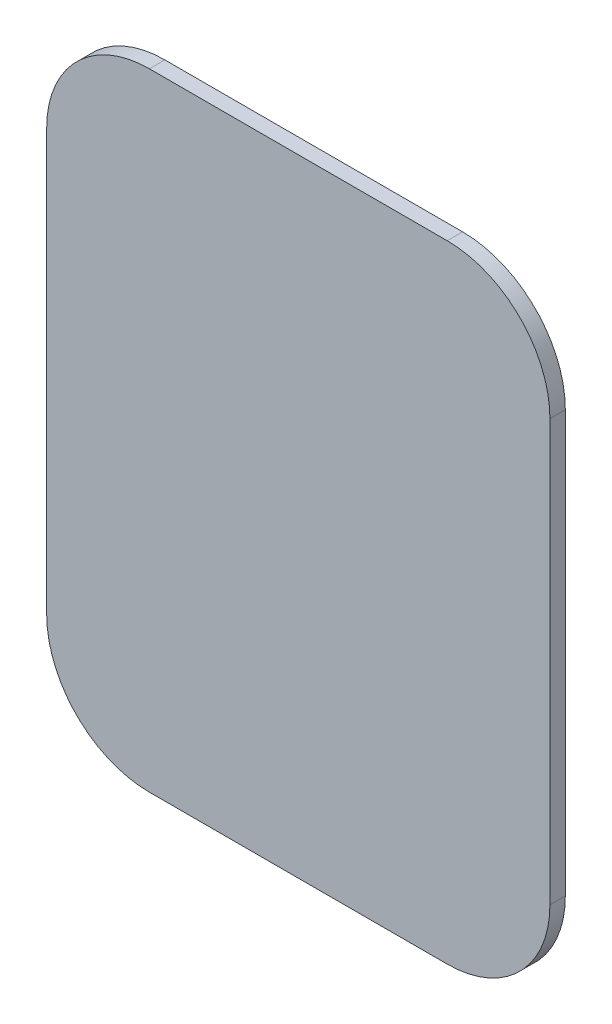
ISO-10303-21;
HEADER;
FILE_DESCRIPTION(('STEP AP214'),'2;1');
FILE_NAME('part.step','',(''),(''),'','','');
FILE_SCHEMA(('AUTOMOTIVE_DESIGN { 1 0 10303 214 1 1 1 1 }'));
ENDSEC;
DATA;
#1=APPLICATION_CONTEXT('core data for automotive mechanical design processes');
#2=APPLICATION_PROTOCOL_DEFINITION('international standard','automotive_design',2000,#1);
#3=PRODUCT_CONTEXT('',#1,'mechanical');
#4=PRODUCT('Part','Part','',(#3));
#5=PRODUCT_RELATED_PRODUCT_CATEGORY('part','',(#4));
#6=PRODUCT_DEFINITION_FORMATION('','',#4);
#7=PRODUCT_DEFINITION_CONTEXT('part definition',#1,'design');
#8=PRODUCT_DEFINITION('design','',#6,#7);
#9=PRODUCT_DEFINITION_SHAPE('','',#8);
#10=(LENGTH_UNIT() NAMED_UNIT(*) SI_UNIT(.MILLI.,.METRE.));
#11=(NAMED_UNIT(*) PLANE_ANGLE_UNIT() SI_UNIT($,.RADIAN.));
#12=(NAMED_UNIT(*) SI_UNIT($,.STERADIAN.) SOLID_ANGLE_UNIT());
#13=UNCERTAINTY_MEASURE_WITH_UNIT(LENGTH_MEASURE(1.E-05),#10,'distance_accuracy_value','');
#14=(GEOMETRIC_REPRESENTATION_CONTEXT(3) GLOBAL_UNCERTAINTY_ASSIGNED_CONTEXT((#13)) GLOBAL_UNIT_ASSIGNED_CONTEXT((#10,
#11,#12)) REPRESENTATION_CONTEXT('',''));
#15=CARTESIAN_POINT('',(0.,0.,0.));
#16=DIRECTION('',(0.,0.,1.));
#17=DIRECTION('',(1.,0.,0.));
#18=AXIS2_PLACEMENT_3D('',#15,#16,#17);
#19=CARTESIAN_POINT('',(49.,61.,3.));
#20=DIRECTION('',(-1.,0.,0.));
#21=DIRECTION('',(0.,-1.,0.));
#22=AXIS2_PLACEMENT_3D('',#19,#20,#21);
#23=PLANE('',#22);
#24=DIRECTION('',(0.,1.,0.));
#25=VECTOR('',#24,1.);
#26=CARTESIAN_POINT('',(49.,61.,3.));
#27=LINE('',#26,#25);
#28=CARTESIAN_POINT('',(49.,-41.,3.));
#29=VERTEX_POINT('',#28);
#30=CARTESIAN_POINT('',(49.,41.,3.));
#31=VERTEX_POINT('',#30);
#32=EDGE_CURVE('E140',#29,#31,#27,.T.);
#33=ORIENTED_EDGE('',*,*,#32,.F.);
#34=DIRECTION('',(0.,0.,-1.));
#35=VECTOR('',#34,1.);
#36=CARTESIAN_POINT('',(49.,-41.,3.));
#37=LINE('',#36,#35);
#38=CARTESIAN_POINT('',(49.,-41.,0.));
#39=VERTEX_POINT('',#38);
#40=EDGE_CURVE('E11',#29,#39,#37,.T.);
#41=ORIENTED_EDGE('',*,*,#40,.T.);
#42=DIRECTION('',(0.,1.,0.));
#43=VECTOR('',#42,1.);
#44=CARTESIAN_POINT('',(49.,61.,0.));
#45=LINE('',#44,#43);
#46=CARTESIAN_POINT('',(49.,41.,0.));
#47=VERTEX_POINT('',#46);
#48=EDGE_CURVE('E142',#39,#47,#45,.T.);
#49=ORIENTED_EDGE('',*,*,#48,.T.);
#50=DIRECTION('',(0.,0.,-1.));
#51=VECTOR('',#50,1.);
#52=CARTESIAN_POINT('',(49.,41.,3.));
#53=LINE('',#52,#51);
#54=EDGE_CURVE('E48',#47,#31,#53,.F.);
#55=ORIENTED_EDGE('',*,*,#54,.T.);
#56=EDGE_LOOP('',(#33,#41,#49,#55));
#57=FACE_BOUND('',#56,.T.);
#58=ADVANCED_FACE('F39',(#57),#23,.F.);
#59=CARTESIAN_POINT('',(-49.,61.,3.));
#60=DIRECTION('',(0.,-1.,0.));
#61=DIRECTION('',(0.,0.,-1.));
#62=AXIS2_PLACEMENT_3D('',#59,#60,#61);
#63=PLANE('',#62);
#64=DIRECTION('',(-1.,0.,0.));
#65=VECTOR('',#64,1.);
#66=CARTESIAN_POINT('',(-49.,61.,0.));
#67=LINE('',#66,#65);
#68=CARTESIAN_POINT('',(29.,61.,0.));
#69=VERTEX_POINT('',#68);
#70=CARTESIAN_POINT('',(-29.,61.,0.));
#71=VERTEX_POINT('',#70);
#72=EDGE_CURVE('E136',#69,#71,#67,.T.);
#73=ORIENTED_EDGE('',*,*,#72,.T.);
#74=DIRECTION('',(0.,0.,-1.));
#75=VECTOR('',#74,1.);
#76=CARTESIAN_POINT('',(-29.,61.,3.));
#77=LINE('',#76,#75);
#78=CARTESIAN_POINT('',(-29.,61.,3.));
#79=VERTEX_POINT('',#78);
#80=EDGE_CURVE('E112',#71,#79,#77,.F.);
#81=ORIENTED_EDGE('',*,*,#80,.T.);
#82=DIRECTION('',(-1.,0.,0.));
#83=VECTOR('',#82,1.);
#84=CARTESIAN_POINT('',(-49.,61.,3.));
#85=LINE('',#84,#83);
#86=CARTESIAN_POINT('',(29.,61.,3.));
#87=VERTEX_POINT('',#86);
#88=EDGE_CURVE('E192',#87,#79,#85,.T.);
#89=ORIENTED_EDGE('',*,*,#88,.F.);
#90=DIRECTION('',(0.,0.,-1.));
#91=VECTOR('',#90,1.);
#92=CARTESIAN_POINT('',(29.,61.,3.));
#93=LINE('',#92,#91);
#94=EDGE_CURVE('E118',#87,#69,#93,.T.);
#95=ORIENTED_EDGE('',*,*,#94,.T.);
#96=EDGE_LOOP('',(#73,#81,#89,#95));
#97=FACE_BOUND('',#96,.T.);
#98=ADVANCED_FACE('F196',(#97),#63,.F.);
#99=CARTESIAN_POINT('',(-49.,61.,3.));
#100=DIRECTION('',(1.,0.,0.));
#101=DIRECTION('',(0.,1.,0.));
#102=AXIS2_PLACEMENT_3D('',#99,#100,#101);
#103=PLANE('',#102);
#104=DIRECTION('',(0.,-1.,0.));
#105=VECTOR('',#104,1.);
#106=CARTESIAN_POINT('',(-49.,61.,3.));
#107=LINE('',#106,#105);
#108=CARTESIAN_POINT('',(-49.,41.,3.));
#109=VERTEX_POINT('',#108);
#110=CARTESIAN_POINT('',(-49.,-41.,3.));
#111=VERTEX_POINT('',#110);
#112=EDGE_CURVE('E127',#109,#111,#107,.T.);
#113=ORIENTED_EDGE('',*,*,#112,.F.);
#114=DIRECTION('',(0.,0.,-1.));
#115=VECTOR('',#114,1.);
#116=CARTESIAN_POINT('',(-49.,41.,3.));
#117=LINE('',#116,#115);
#118=CARTESIAN_POINT('',(-49.,41.,0.));
#119=VERTEX_POINT('',#118);
#120=EDGE_CURVE('E111',#109,#119,#117,.T.);
#121=ORIENTED_EDGE('',*,*,#120,.T.);
#122=DIRECTION('',(0.,-1.,0.));
#123=VECTOR('',#122,1.);
#124=CARTESIAN_POINT('',(-49.,61.,0.));
#125=LINE('',#124,#123);
#126=CARTESIAN_POINT('',(-49.,-41.,0.));
#127=VERTEX_POINT('',#126);
#128=EDGE_CURVE('E125',#119,#127,#125,.T.);
#129=ORIENTED_EDGE('',*,*,#128,.T.);
#130=DIRECTION('',(0.,0.,-1.));
#131=VECTOR('',#130,1.);
#132=CARTESIAN_POINT('',(-49.,-41.,3.));
#133=LINE('',#132,#131);
#134=EDGE_CURVE('E130',#127,#111,#133,.F.);
#135=ORIENTED_EDGE('',*,*,#134,.T.);
#136=EDGE_LOOP('',(#113,#121,#129,#135));
#137=FACE_BOUND('',#136,.T.);
#138=ADVANCED_FACE('F124',(#137),#103,.F.);
#139=CARTESIAN_POINT('',(-49.,-61.,3.));
#140=DIRECTION('',(0.,1.,0.));
#141=DIRECTION('',(0.,0.,1.));
#142=AXIS2_PLACEMENT_3D('',#139,#140,#141);
#143=PLANE('',#142);
#144=DIRECTION('',(1.,0.,0.));
#145=VECTOR('',#144,1.);
#146=CARTESIAN_POINT('',(-49.,-61.,3.));
#147=LINE('',#146,#145);
#148=CARTESIAN_POINT('',(-29.,-61.,3.));
#149=VERTEX_POINT('',#148);
#150=CARTESIAN_POINT('',(29.,-61.,3.));
#151=VERTEX_POINT('',#150);
#152=EDGE_CURVE('E147',#149,#151,#147,.T.);
#153=ORIENTED_EDGE('',*,*,#152,.F.);
#154=DIRECTION('',(0.,0.,-1.));
#155=VECTOR('',#154,1.);
#156=CARTESIAN_POINT('',(-29.,-61.,3.));
#157=LINE('',#156,#155);
#158=CARTESIAN_POINT('',(-29.,-61.,0.));
#159=VERTEX_POINT('',#158);
#160=EDGE_CURVE('E174',#149,#159,#157,.T.);
#161=ORIENTED_EDGE('',*,*,#160,.T.);
#162=DIRECTION('',(1.,0.,0.));
#163=VECTOR('',#162,1.);
#164=CARTESIAN_POINT('',(-49.,-61.,0.));
#165=LINE('',#164,#163);
#166=CARTESIAN_POINT('',(29.,-61.,0.));
#167=VERTEX_POINT('',#166);
#168=EDGE_CURVE('E135',#159,#167,#165,.T.);
#169=ORIENTED_EDGE('',*,*,#168,.T.);
#170=DIRECTION('',(0.,0.,-1.));
#171=VECTOR('',#170,1.);
#172=CARTESIAN_POINT('',(29.,-61.,3.));
#173=LINE('',#172,#171);
#174=EDGE_CURVE('E55',#167,#151,#173,.F.);
#175=ORIENTED_EDGE('',*,*,#174,.T.);
#176=EDGE_LOOP('',(#153,#161,#169,#175));
#177=FACE_BOUND('',#176,.T.);
#178=ADVANCED_FACE('F207',(#177),#143,.F.);
#179=CARTESIAN_POINT('',(0.,0.,3.));
#180=DIRECTION('',(0.,0.,1.));
#181=DIRECTION('',(1.,0.,0.));
#182=AXIS2_PLACEMENT_3D('',#179,#180,#181);
#183=PLANE('',#182);
#184=ORIENTED_EDGE('',*,*,#88,.T.);
#185=CARTESIAN_POINT('',(-29.,41.,3.));
#186=DIRECTION('',(0.,0.,1.));
#187=DIRECTION('',(1.,0.,0.));
#188=AXIS2_PLACEMENT_3D('',#185,#186,#187);
#189=CIRCLE('',#188,20.);
#190=EDGE_CURVE('E169',#79,#109,#189,.T.);
#191=ORIENTED_EDGE('',*,*,#190,.T.);
#192=ORIENTED_EDGE('',*,*,#112,.T.);
#193=CARTESIAN_POINT('',(-29.,-41.,3.));
#194=DIRECTION('',(0.,0.,1.));
#195=DIRECTION('',(1.,0.,0.));
#196=AXIS2_PLACEMENT_3D('',#193,#194,#195);
#197=CIRCLE('',#196,20.);
#198=EDGE_CURVE('E62',#111,#149,#197,.T.);
#199=ORIENTED_EDGE('',*,*,#198,.T.);
#200=ORIENTED_EDGE('',*,*,#152,.T.);
#201=CARTESIAN_POINT('',(29.,-41.,3.));
#202=DIRECTION('',(0.,0.,1.));
#203=DIRECTION('',(1.,0.,0.));
#204=AXIS2_PLACEMENT_3D('',#201,#202,#203);
#205=CIRCLE('',#204,20.);
#206=EDGE_CURVE('E164',#151,#29,#205,.T.);
#207=ORIENTED_EDGE('',*,*,#206,.T.);
#208=ORIENTED_EDGE('',*,*,#32,.T.);
#209=CARTESIAN_POINT('',(29.,41.,3.));
#210=DIRECTION('',(0.,0.,1.));
#211=DIRECTION('',(1.,0.,0.));
#212=AXIS2_PLACEMENT_3D('',#209,#210,#211);
#213=CIRCLE('',#212,20.);
#214=EDGE_CURVE('E161',#31,#87,#213,.T.);
#215=ORIENTED_EDGE('',*,*,#214,.T.);
#216=EDGE_LOOP('',(#184,#191,#192,#199,#200,#207,#208,#215));
#217=FACE_BOUND('',#216,.T.);
#218=ADVANCED_FACE('F188',(#217),#183,.T.);
#219=CARTESIAN_POINT('',(0.,0.,0.));
#220=DIRECTION('',(0.,0.,1.));
#221=DIRECTION('',(1.,0.,0.));
#222=AXIS2_PLACEMENT_3D('',#219,#220,#221);
#223=PLANE('',#222);
#224=ORIENTED_EDGE('',*,*,#128,.F.);
#225=CARTESIAN_POINT('',(-29.,41.,0.));
#226=DIRECTION('',(0.,0.,1.));
#227=DIRECTION('',(1.,0.,0.));
#228=AXIS2_PLACEMENT_3D('',#225,#226,#227);
#229=CIRCLE('',#228,20.);
#230=EDGE_CURVE('E107',#119,#71,#229,.F.);
#231=ORIENTED_EDGE('',*,*,#230,.T.);
#232=ORIENTED_EDGE('',*,*,#72,.F.);
#233=CARTESIAN_POINT('',(29.,41.,0.));
#234=DIRECTION('',(0.,0.,1.));
#235=DIRECTION('',(1.,0.,0.));
#236=AXIS2_PLACEMENT_3D('',#233,#234,#235);
#237=CIRCLE('',#236,20.);
#238=EDGE_CURVE('E129',#69,#47,#237,.F.);
#239=ORIENTED_EDGE('',*,*,#238,.T.);
#240=ORIENTED_EDGE('',*,*,#48,.F.);
#241=CARTESIAN_POINT('',(29.,-41.,0.));
#242=DIRECTION('',(0.,0.,1.));
#243=DIRECTION('',(1.,0.,0.));
#244=AXIS2_PLACEMENT_3D('',#241,#242,#243);
#245=CIRCLE('',#244,20.);
#246=EDGE_CURVE('E151',#39,#167,#245,.F.);
#247=ORIENTED_EDGE('',*,*,#246,.T.);
#248=ORIENTED_EDGE('',*,*,#168,.F.);
#249=CARTESIAN_POINT('',(-29.,-41.,0.));
#250=DIRECTION('',(0.,0.,1.));
#251=DIRECTION('',(1.,0.,0.));
#252=AXIS2_PLACEMENT_3D('',#249,#250,#251);
#253=CIRCLE('',#252,20.);
#254=EDGE_CURVE('E119',#159,#127,#253,.F.);
#255=ORIENTED_EDGE('',*,*,#254,.T.);
#256=EDGE_LOOP('',(#224,#231,#232,#239,#240,#247,#248,#255));
#257=FACE_BOUND('',#256,.T.);
#258=ADVANCED_FACE('F132',(#257),#223,.F.);
#259=CARTESIAN_POINT('',(-29.,41.,3.));
#260=DIRECTION('',(0.,0.,-1.));
#261=DIRECTION('',(-1.,0.,0.));
#262=AXIS2_PLACEMENT_3D('',#259,#260,#261);
#263=CYLINDRICAL_SURFACE('',#262,20.);
#264=ORIENTED_EDGE('',*,*,#190,.F.);
#265=ORIENTED_EDGE('',*,*,#80,.F.);
#266=ORIENTED_EDGE('',*,*,#230,.F.);
#267=ORIENTED_EDGE('',*,*,#120,.F.);
#268=EDGE_LOOP('',(#264,#265,#266,#267));
#269=FACE_BOUND('',#268,.T.);
#270=ADVANCED_FACE('F110',(#269),#263,.T.);
#271=CARTESIAN_POINT('',(-29.,-41.,3.));
#272=DIRECTION('',(0.,0.,-1.));
#273=DIRECTION('',(-1.,0.,0.));
#274=AXIS2_PLACEMENT_3D('',#271,#272,#273);
#275=CYLINDRICAL_SURFACE('',#274,20.);
#276=ORIENTED_EDGE('',*,*,#198,.F.);
#277=ORIENTED_EDGE('',*,*,#134,.F.);
#278=ORIENTED_EDGE('',*,*,#254,.F.);
#279=ORIENTED_EDGE('',*,*,#160,.F.);
#280=EDGE_LOOP('',(#276,#277,#278,#279));
#281=FACE_BOUND('',#280,.T.);
#282=ADVANCED_FACE('F206',(#281),#275,.T.);
#283=CARTESIAN_POINT('',(29.,-41.,3.));
#284=DIRECTION('',(0.,0.,-1.));
#285=DIRECTION('',(-1.,0.,0.));
#286=AXIS2_PLACEMENT_3D('',#283,#284,#285);
#287=CYLINDRICAL_SURFACE('',#286,20.);
#288=ORIENTED_EDGE('',*,*,#206,.F.);
#289=ORIENTED_EDGE('',*,*,#174,.F.);
#290=ORIENTED_EDGE('',*,*,#246,.F.);
#291=ORIENTED_EDGE('',*,*,#40,.F.);
#292=EDGE_LOOP('',(#288,#289,#290,#291));
#293=FACE_BOUND('',#292,.T.);
#294=ADVANCED_FACE('F209',(#293),#287,.T.);
#295=CARTESIAN_POINT('',(29.,41.,3.));
#296=DIRECTION('',(0.,0.,-1.));
#297=DIRECTION('',(-1.,0.,0.));
#298=AXIS2_PLACEMENT_3D('',#295,#296,#297);
#299=CYLINDRICAL_SURFACE('',#298,20.);
#300=ORIENTED_EDGE('',*,*,#214,.F.);
#301=ORIENTED_EDGE('',*,*,#54,.F.);
#302=ORIENTED_EDGE('',*,*,#238,.F.);
#303=ORIENTED_EDGE('',*,*,#94,.F.);
#304=EDGE_LOOP('',(#300,#301,#302,#303));
#305=FACE_BOUND('',#304,.T.);
#306=ADVANCED_FACE('F41',(#305),#299,.T.);
#307=CLOSED_SHELL('',(#58,#98,#138,#178,#218,#258,#270,#282,#294,#306));
#308=MANIFOLD_SOLID_BREP('B2',#307);
#309=ADVANCED_BREP_SHAPE_REPRESENTATION('',(#18,#308),#14);
#310=SHAPE_DEFINITION_REPRESENTATION(#9,#309);
ENDSEC;
END-ISO-10303-21;
